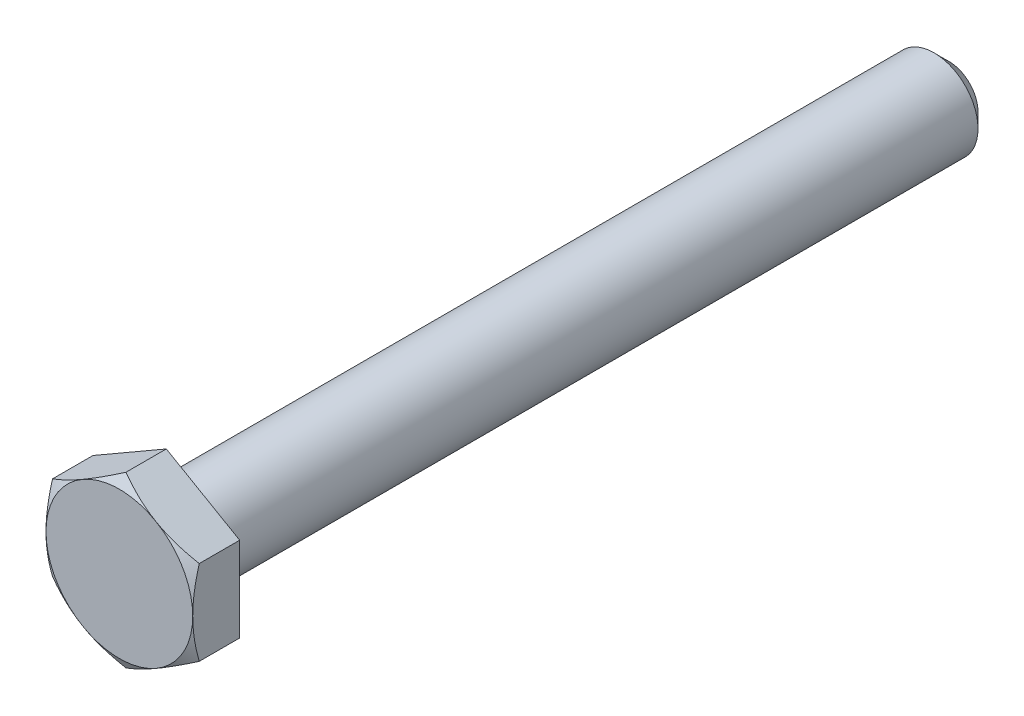
ISO-10303-21;
HEADER;
FILE_DESCRIPTION(('STEP AP214'),'2;1');
FILE_NAME('part.step','',(''),(''),'','','');
FILE_SCHEMA(('AUTOMOTIVE_DESIGN { 1 0 10303 214 1 1 1 1 }'));
ENDSEC;
DATA;
#1=APPLICATION_CONTEXT('core data for automotive mechanical design processes');
#2=APPLICATION_PROTOCOL_DEFINITION('international standard','automotive_design',2000,#1);
#3=PRODUCT_CONTEXT('',#1,'mechanical');
#4=PRODUCT('Part','Part','',(#3));
#5=PRODUCT_RELATED_PRODUCT_CATEGORY('part','',(#4));
#6=PRODUCT_DEFINITION_FORMATION('','',#4);
#7=PRODUCT_DEFINITION_CONTEXT('part definition',#1,'design');
#8=PRODUCT_DEFINITION('design','',#6,#7);
#9=PRODUCT_DEFINITION_SHAPE('','',#8);
#10=(LENGTH_UNIT() NAMED_UNIT(*) SI_UNIT(.MILLI.,.METRE.));
#11=(NAMED_UNIT(*) PLANE_ANGLE_UNIT() SI_UNIT($,.RADIAN.));
#12=(NAMED_UNIT(*) SI_UNIT($,.STERADIAN.) SOLID_ANGLE_UNIT());
#13=UNCERTAINTY_MEASURE_WITH_UNIT(LENGTH_MEASURE(1.E-05),#10,'distance_accuracy_value','');
#14=(GEOMETRIC_REPRESENTATION_CONTEXT(3) GLOBAL_UNCERTAINTY_ASSIGNED_CONTEXT((#13)) GLOBAL_UNIT_ASSIGNED_CONTEXT((#10,
#11,#12)) REPRESENTATION_CONTEXT('',''));
#15=CARTESIAN_POINT('',(0.,0.,0.));
#16=DIRECTION('',(0.,0.,1.));
#17=DIRECTION('',(1.,0.,0.));
#18=AXIS2_PLACEMENT_3D('',#15,#16,#17);
#19=CARTESIAN_POINT('',(-2.38125,1.3748153285078,1.524));
#20=DIRECTION('',(1.,0.,0.));
#21=DIRECTION('',(0.,1.,0.));
#22=AXIS2_PLACEMENT_3D('',#19,#20,#21);
#23=PLANE('',#22);
#24=CARTESIAN_POINT('',(-2.38125,-3.72295653028019,0.347295723197019));
#25=CARTESIAN_POINT('',(-2.38125,-3.61868189168975,0.39799830808582));
#26=CARTESIAN_POINT('',(-2.38125,-3.51417105650191,0.448223296245568));
#27=CARTESIAN_POINT('',(-2.38125,-3.30455147150767,0.547450011789698));
#28=CARTESIAN_POINT('',(-2.38125,-3.19944263320548,0.596451552018138));
#29=CARTESIAN_POINT('',(-2.38125,-2.98797441488905,0.693203359161538));
#30=CARTESIAN_POINT('',(-2.38125,-2.88161135972016,0.740945620586617));
#31=CARTESIAN_POINT('',(-2.38125,-2.66804955727179,0.834515667352319));
#32=CARTESIAN_POINT('',(-2.38125,-2.56085084891739,0.880343541241053));
#33=CARTESIAN_POINT('',(-2.38125,-2.34190265284614,0.971048746156232));
#34=CARTESIAN_POINT('',(-2.38125,-2.23011947827853,1.01584519844831));
#35=CARTESIAN_POINT('',(-2.38125,-2.00525654511055,1.1021198800742));
#36=CARTESIAN_POINT('',(-2.38125,-1.89217664428974,1.14359774137887));
#37=CARTESIAN_POINT('',(-2.38125,-1.66474234548094,1.22216855747077));
#38=CARTESIAN_POINT('',(-2.38125,-1.55039095344034,1.25927012747786));
#39=CARTESIAN_POINT('',(-2.38125,-1.32004815268858,1.32791783381432));
#40=CARTESIAN_POINT('',(-2.38125,-1.20405726306056,1.35946568775632));
#41=CARTESIAN_POINT('',(-2.38125,-0.971004424802135,1.41534624680367));
#42=CARTESIAN_POINT('',(-2.38125,-0.853952079694982,1.43971827503559));
#43=CARTESIAN_POINT('',(-2.38125,-0.618360932324747,1.47988575224577));
#44=CARTESIAN_POINT('',(-2.38125,-0.49982228585687,1.49568209257075));
#45=CARTESIAN_POINT('',(-2.38125,-0.263411783501214,1.51723256640088));
#46=CARTESIAN_POINT('',(-2.38125,-0.145552217253892,1.52311819825417));
#47=CARTESIAN_POINT('',(-2.38125,0.0902469882909462,1.5246964092295));
#48=CARTESIAN_POINT('',(-2.38125,0.208186629163103,1.52038878173782));
#49=CARTESIAN_POINT('',(-2.38125,0.407504133705734,1.50480280470209));
#50=CARTESIAN_POINT('',(-2.38125,0.489091811022688,1.49604313662033));
#51=CARTESIAN_POINT('',(-2.38125,0.65168776654852,1.47417502276688));
#52=CARTESIAN_POINT('',(-2.38125,0.732695968164483,1.46106601258226));
#53=CARTESIAN_POINT('',(-2.38125,0.974720383371604,1.41590017432699));
#54=CARTESIAN_POINT('',(-2.38125,1.13465239958087,1.37801199221108));
#55=CARTESIAN_POINT('',(-2.38125,1.45491499105269,1.28980234008082));
#56=CARTESIAN_POINT('',(-2.38125,1.61516887955235,1.23921303656046));
#57=CARTESIAN_POINT('',(-2.38125,1.85331898963635,1.15706065138242));
#58=CARTESIAN_POINT('',(-2.38125,1.93232383891643,1.12863451299565));
#59=CARTESIAN_POINT('',(-2.38125,2.08967618550711,1.07001988002943));
#60=CARTESIAN_POINT('',(-2.38125,2.16802369591024,1.03983142064671));
#61=CARTESIAN_POINT('',(-2.38125,2.37294280672842,0.958654138252437));
#62=CARTESIAN_POINT('',(-2.38125,2.49903666021092,0.906461988552469));
#63=CARTESIAN_POINT('',(-2.38125,2.74998136224185,0.799160341177421));
#64=CARTESIAN_POINT('',(-2.38125,2.87483209234476,0.744050568610649));
#65=CARTESIAN_POINT('',(-2.38125,3.12356108563469,0.631584800956429));
#66=CARTESIAN_POINT('',(-2.38125,3.24743903508509,0.574228114259329));
#67=CARTESIAN_POINT('',(-2.38125,3.49437791011449,0.457779044774698));
#68=CARTESIAN_POINT('',(-2.38125,3.61743881273939,0.398686613474028));
#69=CARTESIAN_POINT('',(-2.38125,3.98598417409783,0.219209412974902));
#70=CARTESIAN_POINT('',(-2.38125,4.23047577866576,0.0967882662559721));
#71=CARTESIAN_POINT('',(-2.38125,4.71762884534308,-0.151507068173107));
#72=CARTESIAN_POINT('',(-2.38125,4.96029063767842,-0.277380612845988));
#73=CARTESIAN_POINT('',(-2.38125,5.41999382326277,-0.518713110346755));
#74=CARTESIAN_POINT('',(-2.38125,5.63715482954061,-0.633944616911392));
#75=CARTESIAN_POINT('',(-2.38125,6.07073385270411,-0.865822975831002));
#76=CARTESIAN_POINT('',(-2.38125,6.28715182843929,-0.982469905002987));
#77=CARTESIAN_POINT('',(-2.38125,6.71873963784327,-1.21645326124542));
#78=CARTESIAN_POINT('',(-2.38125,6.9339112586046,-1.33378639593857));
#79=CARTESIAN_POINT('',(-2.38125,7.36378914713528,-1.56926573870378));
#80=CARTESIAN_POINT('',(-2.38125,7.57849544734519,-1.68741188752962));
#81=CARTESIAN_POINT('',(-2.38125,7.7930366029864,-1.8058550835397));
#82=B_SPLINE_CURVE_WITH_KNOTS('',3,(#24,#25,#26,#27,#28,#29,#30,#31,#32,#33,#34,#35,#36,#37,#38,
#39,#40,#41,#42,#43,#44,#45,#46,#47,#48,#49,#50,#51,#52,#53,#54,#55,#56,#57,#58,#59,#60,#61,#62,
#63,#64,#65,#66,#67,#68,#69,#70,#71,#72,#73,#74,#75,#76,#77,#78,#79,#80,#81),.UNSPECIFIED.,.F.,
.F.,(4,2,2,2,2,2,2,2,2,2,2,2,2,2,2,2,2,2,2,2,2,2,2,2,2,2,2,2,4),(0.,0.347848286322985,
0.695749462410191,1.04549398187111,1.39522230629083,1.75645680944357,2.11773131785305,
2.47828230803162,2.83872159298725,3.19714726948549,3.55553568451205,3.90913029500077,
4.26273207278691,4.50878403770547,4.75486794521598,5.24728758906121,5.75112095216684,
6.0029940882462,6.25486219568594,6.66421526437248,7.0736069702368,7.48312569426576,
7.89265587503668,8.71288987650312,9.53297212651482,10.270484381026,11.0080368420114,
11.743285197103,12.4784805286552),.UNSPECIFIED.);
#83=CARTESIAN_POINT('',(-2.38125,1.3748153285078,1.3113153285078));
#84=VERTEX_POINT('',#83);
#85=CARTESIAN_POINT('',(-2.38125,0.,1.524));
#86=VERTEX_POINT('',#85);
#87=EDGE_CURVE('E199',#84,#86,#82,.F.);
#88=ORIENTED_EDGE('',*,*,#87,.F.);
#89=DIRECTION('',(0.,0.,-1.));
#90=VECTOR('',#89,1.);
#91=CARTESIAN_POINT('',(-2.38125,1.3748153285078,1.524));
#92=LINE('',#91,#90);
#93=CARTESIAN_POINT('',(-2.38125,1.3748153285078,0.));
#94=VERTEX_POINT('',#93);
#95=EDGE_CURVE('E202',#84,#94,#92,.T.);
#96=ORIENTED_EDGE('',*,*,#95,.T.);
#97=DIRECTION('',(0.,-1.,0.));
#98=VECTOR('',#97,1.);
#99=CARTESIAN_POINT('',(-2.38125,1.3748153285078,0.));
#100=LINE('',#99,#98);
#101=CARTESIAN_POINT('',(-2.38125,-1.3748153285078,0.));
#102=VERTEX_POINT('',#101);
#103=EDGE_CURVE('E261',#94,#102,#100,.T.);
#104=ORIENTED_EDGE('',*,*,#103,.T.);
#105=DIRECTION('',(0.,0.,-1.));
#106=VECTOR('',#105,1.);
#107=CARTESIAN_POINT('',(-2.38125,-1.3748153285078,1.524));
#108=LINE('',#107,#106);
#109=CARTESIAN_POINT('',(-2.38125,-1.3748153285078,1.3113153285078));
#110=VERTEX_POINT('',#109);
#111=EDGE_CURVE('E223',#110,#102,#108,.T.);
#112=ORIENTED_EDGE('',*,*,#111,.F.);
#113=EDGE_CURVE('E171',#86,#110,#82,.F.);
#114=ORIENTED_EDGE('',*,*,#113,.F.);
#115=EDGE_LOOP('',(#88,#96,#104,#112,#114));
#116=FACE_BOUND('',#115,.T.);
#117=ADVANCED_FACE('F34',(#116),#23,.F.);
#118=CARTESIAN_POINT('',(-2.38125,-1.3748153285078,1.524));
#119=DIRECTION('',(0.5,0.866025403784439,0.));
#120=DIRECTION('',(-0.866025403784439,0.5,0.));
#121=AXIS2_PLACEMENT_3D('',#118,#119,#120);
#122=PLANE('',#121);
#123=CARTESIAN_POINT('',(-2.38145,-1.37469985845396,1.31124865764183));
#124=CARTESIAN_POINT('',(-2.27680510857802,-1.43511661468576,1.34614474988255));
#125=CARTESIAN_POINT('',(-2.1712569313955,-1.49605488319456,1.37788175573291));
#126=CARTESIAN_POINT('',(-1.95833280582789,-1.61898668440799,1.43327966568469));
#127=CARTESIAN_POINT('',(-1.85095307338658,-1.68098240183849,1.45692097092417));
#128=CARTESIAN_POINT('',(-1.63752441306379,-1.80420549632863,1.49372299311087));
#129=CARTESIAN_POINT('',(-1.53150832846243,-1.86541391131166,1.50712863194375));
#130=CARTESIAN_POINT('',(-1.31897718209788,-1.98811882587641,1.52313371400332));
#131=CARTESIAN_POINT('',(-1.21246289310218,-2.04961487930062,1.52574640919312));
#132=CARTESIAN_POINT('',(-1.01342600969028,-2.16452887751715,1.52031824805064));
#133=CARTESIAN_POINT('',(-0.920873657438137,-2.21796400300405,1.51361019155889));
#134=CARTESIAN_POINT('',(-0.736371946153155,-2.32448611568038,1.49234736779483));
#135=CARTESIAN_POINT('',(-0.644423225529255,-2.37757273428423,1.47778533338426));
#136=CARTESIAN_POINT('',(-0.459540942889938,-2.48431456993443,1.44138049969123));
#137=CARTESIAN_POINT('',(-0.366630787034623,-2.53795627342795,1.41938334353506));
#138=CARTESIAN_POINT('',(-0.182196405744564,-2.64443951311359,1.36945811380597));
#139=CARTESIAN_POINT('',(-0.0906698164537964,-2.69728241407862,1.34154177499956));
#140=CARTESIAN_POINT('',(0.000199999999998326,-2.74974612706943,1.31124865764183));
#141=B_SPLINE_CURVE_WITH_KNOTS('',3,(#123,#124,#125,#126,#127,#128,#129,#130,#131,#132,#133,
#134,#135,#136,#137,#138,#139,#140),.UNSPECIFIED.,.F.,.F.,(4,2,2,2,2,2,2,2,4),(0.,
0.377463001720441,0.755833447356088,1.12483885453941,1.49339104874267,1.81432726847354,
2.1355609551887,2.46392121913821,2.79163649648301),.UNSPECIFIED.);
#142=CARTESIAN_POINT('',(-1.190625,-2.06222299276169,1.524));
#143=VERTEX_POINT('',#142);
#144=EDGE_CURVE('E169',#110,#143,#141,.T.);
#145=ORIENTED_EDGE('',*,*,#144,.F.);
#146=ORIENTED_EDGE('',*,*,#111,.T.);
#147=DIRECTION('',(0.866025403784439,-0.5,0.));
#148=VECTOR('',#147,1.);
#149=CARTESIAN_POINT('',(-2.38125,-1.3748153285078,0.));
#150=LINE('',#149,#148);
#151=CARTESIAN_POINT('',(0.,-2.74963065701559,0.));
#152=VERTEX_POINT('',#151);
#153=EDGE_CURVE('E253',#102,#152,#150,.T.);
#154=ORIENTED_EDGE('',*,*,#153,.T.);
#155=DIRECTION('',(0.,0.,-1.));
#156=VECTOR('',#155,1.);
#157=CARTESIAN_POINT('',(0.,-2.74963065701559,1.524));
#158=LINE('',#157,#156);
#159=CARTESIAN_POINT('',(0.,-2.74963065701559,1.3113153285078));
#160=VERTEX_POINT('',#159);
#161=EDGE_CURVE('E221',#160,#152,#158,.T.);
#162=ORIENTED_EDGE('',*,*,#161,.F.);
#163=EDGE_CURVE('E165',#143,#160,#141,.T.);
#164=ORIENTED_EDGE('',*,*,#163,.F.);
#165=EDGE_LOOP('',(#145,#146,#154,#162,#164));
#166=FACE_BOUND('',#165,.T.);
#167=ADVANCED_FACE('F176',(#166),#122,.F.);
#168=CARTESIAN_POINT('',(0.,-2.74963065701559,1.524));
#169=DIRECTION('',(-0.5,0.866025403784438,0.));
#170=DIRECTION('',(-0.866025403784439,-0.5,0.));
#171=AXIS2_PLACEMENT_3D('',#168,#169,#170);
#172=PLANE('',#171);
#173=CARTESIAN_POINT('',(-0.000200000000001737,-2.74974612706943,1.31124865764183));
#174=CARTESIAN_POINT('',(0.104444891421974,-2.68932937083763,1.34614474988255));
#175=CARTESIAN_POINT('',(0.209993068604494,-2.62839110232883,1.37788175573291));
#176=CARTESIAN_POINT('',(0.422917194172109,-2.5054593011154,1.43327966568469));
#177=CARTESIAN_POINT('',(0.530296926613417,-2.4434635836849,1.45692097092417));
#178=CARTESIAN_POINT('',(0.743725586936213,-2.32024048919476,1.49372299311088));
#179=CARTESIAN_POINT('',(0.849741671537566,-2.25903207421174,1.50712863194375));
#180=CARTESIAN_POINT('',(1.06227281790212,-2.13632715964698,1.52313371400332));
#181=CARTESIAN_POINT('',(1.16878710689781,-2.07483110622277,1.52574640919312));
#182=CARTESIAN_POINT('',(1.36782399030972,-1.95991710800624,1.52031824805064));
#183=CARTESIAN_POINT('',(1.46037634256186,-1.90648198251934,1.51361019155889));
#184=CARTESIAN_POINT('',(1.64487805384684,-1.79995986984301,1.49234736779484));
#185=CARTESIAN_POINT('',(1.73682677447075,-1.74687325123916,1.47778533338426));
#186=CARTESIAN_POINT('',(1.92170905711006,-1.64013141558895,1.44138049969123));
#187=CARTESIAN_POINT('',(2.01461921296538,-1.58648971209544,1.41938334353506));
#188=CARTESIAN_POINT('',(2.19905359425544,-1.4800064724098,1.36945811380597));
#189=CARTESIAN_POINT('',(2.29058018354621,-1.42716357144477,1.34154177499956));
#190=CARTESIAN_POINT('',(2.38145,-1.37469985845396,1.31124865764183));
#191=B_SPLINE_CURVE_WITH_KNOTS('',3,(#173,#174,#175,#176,#177,#178,#179,#180,#181,#182,#183,
#184,#185,#186,#187,#188,#189,#190),.UNSPECIFIED.,.F.,.F.,(4,2,2,2,2,2,2,2,4),(0.,
0.377463001720441,0.755833447356088,1.12483885453941,1.49339104874267,1.81432726847354,
2.1355609551887,2.46392121913821,2.79163649648301),.UNSPECIFIED.);
#192=CARTESIAN_POINT('',(1.190625,-2.06222299276169,1.524));
#193=VERTEX_POINT('',#192);
#194=EDGE_CURVE('E170',#160,#193,#191,.T.);
#195=ORIENTED_EDGE('',*,*,#194,.F.);
#196=ORIENTED_EDGE('',*,*,#161,.T.);
#197=DIRECTION('',(0.866025403784438,0.5,0.));
#198=VECTOR('',#197,1.);
#199=CARTESIAN_POINT('',(0.,-2.74963065701559,0.));
#200=LINE('',#199,#198);
#201=CARTESIAN_POINT('',(2.38125,-1.37481532850779,0.));
#202=VERTEX_POINT('',#201);
#203=EDGE_CURVE('E248',#152,#202,#200,.T.);
#204=ORIENTED_EDGE('',*,*,#203,.T.);
#205=DIRECTION('',(0.,0.,-1.));
#206=VECTOR('',#205,1.);
#207=CARTESIAN_POINT('',(2.38125,-1.37481532850779,1.524));
#208=LINE('',#207,#206);
#209=CARTESIAN_POINT('',(2.38125,-1.374815328508,1.31131532850793));
#210=VERTEX_POINT('',#209);
#211=EDGE_CURVE('E219',#210,#202,#208,.T.);
#212=ORIENTED_EDGE('',*,*,#211,.F.);
#213=EDGE_CURVE('E159',#193,#210,#191,.T.);
#214=ORIENTED_EDGE('',*,*,#213,.F.);
#215=EDGE_LOOP('',(#195,#196,#204,#212,#214));
#216=FACE_BOUND('',#215,.T.);
#217=ADVANCED_FACE('F179',(#216),#172,.F.);
#218=CARTESIAN_POINT('',(2.38125,-1.37481532850779,1.524));
#219=DIRECTION('',(-1.,0.,0.));
#220=DIRECTION('',(0.,0.,1.));
#221=AXIS2_PLACEMENT_3D('',#218,#219,#220);
#222=PLANE('',#221);
#223=CARTESIAN_POINT('',(2.38125,-3.72295652963773,0.347295723509494));
#224=CARTESIAN_POINT('',(2.38125,-3.6186818910689,0.397998308385245));
#225=CARTESIAN_POINT('',(2.38125,-3.5141710559027,0.448223296531951));
#226=CARTESIAN_POINT('',(2.38125,-3.30455147095179,0.547450012050059));
#227=CARTESIAN_POINT('',(2.38125,-3.19944263267129,0.59645155226552));
#228=CARTESIAN_POINT('',(2.38125,-2.98797441439859,0.693203359382952));
#229=CARTESIAN_POINT('',(2.38125,-2.88161135925173,0.740945620795045));
#230=CARTESIAN_POINT('',(2.38125,-2.66804955684758,0.834515667534991));
#231=CARTESIAN_POINT('',(2.38125,-2.56085084851536,0.880343541410955));
#232=CARTESIAN_POINT('',(2.38125,-2.34190265249017,0.971048746300243));
#233=CARTESIAN_POINT('',(2.38125,-2.23011947794644,1.01584519857922));
#234=CARTESIAN_POINT('',(2.38125,-2.00525654482662,1.10211988017963));
#235=CARTESIAN_POINT('',(2.38125,-1.89217664403008,1.14359774147191));
#236=CARTESIAN_POINT('',(2.38125,-1.66474234527027,1.22216855754021));
#237=CARTESIAN_POINT('',(2.38125,-1.55039095325439,1.2592701275361));
#238=CARTESIAN_POINT('',(2.38125,-1.32004815255276,1.32791783385198));
#239=CARTESIAN_POINT('',(2.38125,-1.20405726295013,1.3594656877846));
#240=CARTESIAN_POINT('',(2.38125,-0.971004424755568,1.41534624681304));
#241=CARTESIAN_POINT('',(2.38125,-0.853952079687063,1.43971827503616));
#242=CARTESIAN_POINT('',(2.38125,-0.618360932395054,1.47988575223456));
#243=CARTESIAN_POINT('',(2.38125,-0.499822285966753,1.49568209255657));
#244=CARTESIAN_POINT('',(2.38125,-0.263411783689592,1.51723256638781));
#245=CARTESIAN_POINT('',(2.38125,-0.145552217481182,1.52311819824505));
#246=CARTESIAN_POINT('',(2.38125,0.0902469879864318,1.52469640923506));
#247=CARTESIAN_POINT('',(2.38125,0.208186628820277,1.52038878175411));
#248=CARTESIAN_POINT('',(2.38125,0.407504133314729,1.50480280474002));
#249=CARTESIAN_POINT('',(2.38125,0.489091810621384,1.49604313666685));
#250=CARTESIAN_POINT('',(2.38125,0.651687766127075,1.47417502283102));
#251=CARTESIAN_POINT('',(2.38125,0.732695967733197,1.46106601265545));
#252=CARTESIAN_POINT('',(2.38125,0.974720382911327,1.4159001744275));
#253=CARTESIAN_POINT('',(2.38125,1.13465239910202,1.37801199233005));
#254=CARTESIAN_POINT('',(2.38125,1.45491499053651,1.28980234023628));
#255=CARTESIAN_POINT('',(2.38125,1.61516887901744,1.23921303673396));
#256=CARTESIAN_POINT('',(2.38125,1.85331898907346,1.15706065158206));
#257=CARTESIAN_POINT('',(2.38125,1.93232383834426,1.12863451320384));
#258=CARTESIAN_POINT('',(2.38125,2.08967618491637,1.07001988025444));
#259=CARTESIAN_POINT('',(2.38125,2.16802369531021,1.03983142087997));
#260=CARTESIAN_POINT('',(2.38125,2.37294280612284,0.958654138499555));
#261=CARTESIAN_POINT('',(2.38125,2.49903665960882,0.906461988804388));
#262=CARTESIAN_POINT('',(2.38125,2.74998136164628,0.799160341437603));
#263=CARTESIAN_POINT('',(2.38125,2.87483209175223,0.744050568874293));
#264=CARTESIAN_POINT('',(2.38125,3.12356108504793,0.631584801226017));
#265=CARTESIAN_POINT('',(2.38125,3.24743903450104,0.574228114531399));
#266=CARTESIAN_POINT('',(2.38125,3.4943779095356,0.457779045051025));
#267=CARTESIAN_POINT('',(2.38125,3.61743881216293,0.39868661375213));
#268=CARTESIAN_POINT('',(2.38125,3.9859841735286,0.21920941325743));
#269=CARTESIAN_POINT('',(2.38125,4.23047577810101,0.0967882665403723));
#270=CARTESIAN_POINT('',(2.38125,4.71762884478668,-0.151507067886102));
#271=CARTESIAN_POINT('',(2.38125,4.96029063712589,-0.27738061255825));
#272=CARTESIAN_POINT('',(2.38125,5.41999382271414,-0.518713110056654));
#273=CARTESIAN_POINT('',(2.38125,5.63715482899205,-0.633944616619566));
#274=CARTESIAN_POINT('',(2.38125,6.07073385215553,-0.865822975536079));
#275=CARTESIAN_POINT('',(2.38125,6.28715182789062,-0.982469904706691));
#276=CARTESIAN_POINT('',(2.38125,6.71873963729376,-1.21645326094634));
#277=CARTESIAN_POINT('',(2.38125,6.93391125805436,-1.33378639563807));
#278=CARTESIAN_POINT('',(2.38125,7.36378914658346,-1.56926573840061));
#279=CARTESIAN_POINT('',(2.38125,7.57849544679253,-1.68741188722519));
#280=CARTESIAN_POINT('',(2.38125,7.79303660243287,-1.80585508323407));
#281=B_SPLINE_CURVE_WITH_KNOTS('',3,(#223,#224,#225,#226,#227,#228,#229,#230,#231,#232,#233,
#234,#235,#236,#237,#238,#239,#240,#241,#242,#243,#244,#245,#246,#247,#248,#249,#250,#251,#252,
#253,#254,#255,#256,#257,#258,#259,#260,#261,#262,#263,#264,#265,#266,#267,#268,#269,#270,#271,
#272,#273,#274,#275,#276,#277,#278,#279,#280),.UNSPECIFIED.,.F.,.F.,(4,2,2,2,2,2,2,2,2,2,2,2,2,
2,2,2,2,2,2,2,2,2,2,2,2,2,2,2,4),(0.,0.347848286247547,0.695749462259305,1.04549398164397,
1.39522230598744,1.75645680905906,2.11773131738739,2.47828230748509,2.8387215923599,
3.1971472687395,3.55553568364759,3.90913029402076,4.26273207169129,4.50878403657638,
4.75486794405342,5.24728758783158,5.7511209508672,6.00299408691165,6.25486219431648,
6.66421526300712,7.07360696887559,7.4831256929088,7.89265587368399,8.71288987515987,
9.53297212518087,10.2704843796898,11.008036840673,11.7432851957606,12.4784805273088),.UNSPECIFIED.);
#282=CARTESIAN_POINT('',(2.38125,0.,1.524));
#283=VERTEX_POINT('',#282);
#284=EDGE_CURVE('E243',#210,#283,#281,.T.);
#285=ORIENTED_EDGE('',*,*,#284,.F.);
#286=ORIENTED_EDGE('',*,*,#211,.T.);
#287=DIRECTION('',(0.,1.,0.));
#288=VECTOR('',#287,1.);
#289=CARTESIAN_POINT('',(2.38125,-1.37481532850779,0.));
#290=LINE('',#289,#288);
#291=CARTESIAN_POINT('',(2.38125,1.3748153285078,0.));
#292=VERTEX_POINT('',#291);
#293=EDGE_CURVE('E252',#202,#292,#290,.T.);
#294=ORIENTED_EDGE('',*,*,#293,.T.);
#295=DIRECTION('',(0.,0.,-1.));
#296=VECTOR('',#295,1.);
#297=CARTESIAN_POINT('',(2.38125,1.3748153285078,1.524));
#298=LINE('',#297,#296);
#299=CARTESIAN_POINT('',(2.38125,1.3748153285078,1.3113153285078));
#300=VERTEX_POINT('',#299);
#301=EDGE_CURVE('E212',#300,#292,#298,.T.);
#302=ORIENTED_EDGE('',*,*,#301,.F.);
#303=EDGE_CURVE('E106',#283,#300,#281,.T.);
#304=ORIENTED_EDGE('',*,*,#303,.F.);
#305=EDGE_LOOP('',(#285,#286,#294,#302,#304));
#306=FACE_BOUND('',#305,.T.);
#307=ADVANCED_FACE('F183',(#306),#222,.F.);
#308=CARTESIAN_POINT('',(2.38125,1.3748153285078,1.524));
#309=DIRECTION('',(-0.5,-0.866025403784439,0.));
#310=DIRECTION('',(0.866025403784439,-0.5,0.));
#311=AXIS2_PLACEMENT_3D('',#308,#309,#310);
#312=PLANE('',#311);
#313=CARTESIAN_POINT('',(2.38145,1.37469985845396,1.31124865764183));
#314=CARTESIAN_POINT('',(2.27680510857802,1.43511661468576,1.34614474988255));
#315=CARTESIAN_POINT('',(2.1712569313955,1.49605488319456,1.37788175573291));
#316=CARTESIAN_POINT('',(1.95833280582789,1.61898668440799,1.43327966568469));
#317=CARTESIAN_POINT('',(1.85095307338658,1.68098240183849,1.45692097092417));
#318=CARTESIAN_POINT('',(1.63752441306379,1.80420549632863,1.49372299311087));
#319=CARTESIAN_POINT('',(1.53150832846243,1.86541391131166,1.50712863194375));
#320=CARTESIAN_POINT('',(1.31897718209788,1.98811882587641,1.52313371400332));
#321=CARTESIAN_POINT('',(1.21246289310218,2.04961487930062,1.52574640919312));
#322=CARTESIAN_POINT('',(1.01342600969028,2.16452887751715,1.52031824805064));
#323=CARTESIAN_POINT('',(0.920873657438137,2.21796400300405,1.51361019155889));
#324=CARTESIAN_POINT('',(0.736371946153155,2.32448611568038,1.49234736779483));
#325=CARTESIAN_POINT('',(0.644423225529254,2.37757273428423,1.47778533338426));
#326=CARTESIAN_POINT('',(0.459540942889937,2.48431456993444,1.44138049969123));
#327=CARTESIAN_POINT('',(0.366630787034622,2.53795627342795,1.41938334353506));
#328=CARTESIAN_POINT('',(0.182196405744563,2.64443951311359,1.36945811380597));
#329=CARTESIAN_POINT('',(0.0906698164537958,2.69728241407862,1.34154177499956));
#330=CARTESIAN_POINT('',(-0.000199999999999503,2.74974612706943,1.31124865764183));
#331=B_SPLINE_CURVE_WITH_KNOTS('',3,(#313,#314,#315,#316,#317,#318,#319,#320,#321,#322,#323,
#324,#325,#326,#327,#328,#329,#330),.UNSPECIFIED.,.F.,.F.,(4,2,2,2,2,2,2,2,4),(0.,
0.377463001720441,0.755833447356088,1.12483885453941,1.49339104874267,1.81432726847354,
2.1355609551887,2.46392121913821,2.79163649648301),.UNSPECIFIED.);
#332=CARTESIAN_POINT('',(1.190625,2.06222299276169,1.524));
#333=VERTEX_POINT('',#332);
#334=EDGE_CURVE('E103',#300,#333,#331,.T.);
#335=ORIENTED_EDGE('',*,*,#334,.F.);
#336=ORIENTED_EDGE('',*,*,#301,.T.);
#337=DIRECTION('',(-0.866025403784439,0.5,0.));
#338=VECTOR('',#337,1.);
#339=CARTESIAN_POINT('',(2.38125,1.3748153285078,0.));
#340=LINE('',#339,#338);
#341=CARTESIAN_POINT('',(0.,2.7496306570156,0.));
#342=VERTEX_POINT('',#341);
#343=EDGE_CURVE('E214',#292,#342,#340,.T.);
#344=ORIENTED_EDGE('',*,*,#343,.T.);
#345=DIRECTION('',(0.,0.,-1.));
#346=VECTOR('',#345,1.);
#347=CARTESIAN_POINT('',(0.,2.7496306570156,1.524));
#348=LINE('',#347,#346);
#349=CARTESIAN_POINT('',(0.,2.7496306570156,1.3113153285078));
#350=VERTEX_POINT('',#349);
#351=EDGE_CURVE('E127',#350,#342,#348,.T.);
#352=ORIENTED_EDGE('',*,*,#351,.F.);
#353=EDGE_CURVE('E110',#333,#350,#331,.T.);
#354=ORIENTED_EDGE('',*,*,#353,.F.);
#355=EDGE_LOOP('',(#335,#336,#344,#352,#354));
#356=FACE_BOUND('',#355,.T.);
#357=ADVANCED_FACE('F125',(#356),#312,.F.);
#358=CARTESIAN_POINT('',(0.,2.7496306570156,1.524));
#359=DIRECTION('',(0.5,-0.866025403784438,0.));
#360=DIRECTION('',(0.866025403784438,0.5,0.));
#361=AXIS2_PLACEMENT_3D('',#358,#359,#360);
#362=PLANE('',#361);
#363=CARTESIAN_POINT('',(0.000200000000000133,2.74974612706943,1.31124865764183));
#364=CARTESIAN_POINT('',(-0.104444891421976,2.68932937083764,1.34614474988255));
#365=CARTESIAN_POINT('',(-0.209993068604496,2.62839110232883,1.37788175573291));
#366=CARTESIAN_POINT('',(-0.422917194172111,2.50545930111541,1.43327966568469));
#367=CARTESIAN_POINT('',(-0.530296926613419,2.44346358368491,1.45692097092417));
#368=CARTESIAN_POINT('',(-0.743725586936215,2.32024048919476,1.49372299311087));
#369=CARTESIAN_POINT('',(-0.849741671537568,2.25903207421174,1.50712863194375));
#370=CARTESIAN_POINT('',(-1.06227281790212,2.13632715964698,1.52313371400332));
#371=CARTESIAN_POINT('',(-1.16878710689782,2.07483110622278,1.52574640919312));
#372=CARTESIAN_POINT('',(-1.36782399030973,1.95991710800625,1.52031824805064));
#373=CARTESIAN_POINT('',(-1.46037634256186,1.90648198251934,1.51361019155889));
#374=CARTESIAN_POINT('',(-1.64487805384685,1.79995986984301,1.49234736779484));
#375=CARTESIAN_POINT('',(-1.73682677447075,1.74687325123916,1.47778533338426));
#376=CARTESIAN_POINT('',(-1.92170905711006,1.64013141558896,1.44138049969123));
#377=CARTESIAN_POINT('',(-2.01461921296538,1.58648971209544,1.41938334353506));
#378=CARTESIAN_POINT('',(-2.19905359425544,1.4800064724098,1.36945811380597));
#379=CARTESIAN_POINT('',(-2.29058018354621,1.42716357144477,1.34154177499956));
#380=CARTESIAN_POINT('',(-2.38145,1.37469985845396,1.31124865764183));
#381=B_SPLINE_CURVE_WITH_KNOTS('',3,(#363,#364,#365,#366,#367,#368,#369,#370,#371,#372,#373,
#374,#375,#376,#377,#378,#379,#380),.UNSPECIFIED.,.F.,.F.,(4,2,2,2,2,2,2,2,4),(0.,
0.377463001720442,0.755833447356089,1.12483885453941,1.49339104874267,1.81432726847354,
2.1355609551887,2.46392121913821,2.79163649648301),.UNSPECIFIED.);
#382=CARTESIAN_POINT('',(-1.190625,2.0622229927617,1.524));
#383=VERTEX_POINT('',#382);
#384=EDGE_CURVE('E116',#350,#383,#381,.T.);
#385=ORIENTED_EDGE('',*,*,#384,.F.);
#386=ORIENTED_EDGE('',*,*,#351,.T.);
#387=DIRECTION('',(-0.866025403784438,-0.5,0.));
#388=VECTOR('',#387,1.);
#389=CARTESIAN_POINT('',(0.,2.7496306570156,0.));
#390=LINE('',#389,#388);
#391=EDGE_CURVE('E209',#342,#94,#390,.T.);
#392=ORIENTED_EDGE('',*,*,#391,.T.);
#393=ORIENTED_EDGE('',*,*,#95,.F.);
#394=EDGE_CURVE('E122',#383,#84,#381,.T.);
#395=ORIENTED_EDGE('',*,*,#394,.F.);
#396=EDGE_LOOP('',(#385,#386,#392,#393,#395));
#397=FACE_BOUND('',#396,.T.);
#398=ADVANCED_FACE('F191',(#397),#362,.F.);
#399=CARTESIAN_POINT('',(-2.38125,-1.3748153285078,0.));
#400=DIRECTION('',(0.,0.,1.));
#401=DIRECTION('',(1.,0.,0.));
#402=AXIS2_PLACEMENT_3D('',#399,#400,#401);
#403=PLANE('',#402);
#404=ORIENTED_EDGE('',*,*,#103,.F.);
#405=ORIENTED_EDGE('',*,*,#391,.F.);
#406=ORIENTED_EDGE('',*,*,#343,.F.);
#407=ORIENTED_EDGE('',*,*,#293,.F.);
#408=ORIENTED_EDGE('',*,*,#203,.F.);
#409=ORIENTED_EDGE('',*,*,#153,.F.);
#410=EDGE_LOOP('',(#404,#405,#406,#407,#408,#409));
#411=FACE_BOUND('',#410,.T.);
#412=CARTESIAN_POINT('',(0.,0.,0.));
#413=DIRECTION('',(0.,0.,1.));
#414=DIRECTION('',(1.,0.,0.));
#415=AXIS2_PLACEMENT_3D('',#412,#413,#414);
#416=CIRCLE('',#415,1.4224);
#417=CARTESIAN_POINT('',(1.4224,0.,0.));
#418=VERTEX_POINT('',#417);
#419=EDGE_CURVE('E224',#418,#418,#416,.F.);
#420=ORIENTED_EDGE('',*,*,#419,.F.);
#421=EDGE_LOOP('',(#420));
#422=FACE_BOUND('',#421,.T.);
#423=ADVANCED_FACE('F256',(#411,#422),#403,.F.);
#424=CARTESIAN_POINT('',(0.,0.,-25.4));
#425=DIRECTION('',(0.,0.,1.));
#426=DIRECTION('',(1.,0.,0.));
#427=AXIS2_PLACEMENT_3D('',#424,#425,#426);
#428=PLANE('',#427);
#429=CARTESIAN_POINT('',(0.,0.,-25.4));
#430=DIRECTION('',(0.,0.,1.));
#431=DIRECTION('',(1.,0.,0.));
#432=AXIS2_PLACEMENT_3D('',#429,#430,#431);
#433=CIRCLE('',#432,0.946150000000007);
#434=CARTESIAN_POINT('',(0.946150000000007,0.,-25.4));
#435=VERTEX_POINT('',#434);
#436=EDGE_CURVE('E263',#435,#435,#433,.F.);
#437=ORIENTED_EDGE('',*,*,#436,.T.);
#438=EDGE_LOOP('',(#437));
#439=FACE_BOUND('',#438,.T.);
#440=ADVANCED_FACE('F277',(#439),#428,.F.);
#441=CARTESIAN_POINT('',(0.,0.,0.));
#442=DIRECTION('',(0.,0.,1.));
#443=DIRECTION('',(1.,0.,0.));
#444=AXIS2_PLACEMENT_3D('',#441,#442,#443);
#445=CYLINDRICAL_SURFACE('',#444,1.4224);
#446=CARTESIAN_POINT('',(0.,0.,-24.92375));
#447=DIRECTION('',(0.,0.,1.));
#448=DIRECTION('',(1.,0.,0.));
#449=AXIS2_PLACEMENT_3D('',#446,#447,#448);
#450=CIRCLE('',#449,1.4224);
#451=CARTESIAN_POINT('',(1.4224,0.,-24.92375));
#452=VERTEX_POINT('',#451);
#453=EDGE_CURVE('E206',#452,#452,#450,.T.);
#454=ORIENTED_EDGE('',*,*,#453,.T.);
#455=EDGE_LOOP('',(#454));
#456=FACE_BOUND('',#455,.T.);
#457=ORIENTED_EDGE('',*,*,#419,.T.);
#458=EDGE_LOOP('',(#457));
#459=FACE_BOUND('',#458,.T.);
#460=ADVANCED_FACE('F151',(#456,#459),#445,.T.);
#461=CARTESIAN_POINT('',(0.,0.,-24.92375));
#462=DIRECTION('',(0.,0.,1.));
#463=DIRECTION('',(1.,0.,0.));
#464=AXIS2_PLACEMENT_3D('',#461,#462,#463);
#465=CONICAL_SURFACE('',#464,1.4224,0.785398163397446);
#466=ORIENTED_EDGE('',*,*,#436,.F.);
#467=EDGE_LOOP('',(#466));
#468=FACE_BOUND('',#467,.T.);
#469=ORIENTED_EDGE('',*,*,#453,.F.);
#470=EDGE_LOOP('',(#469));
#471=FACE_BOUND('',#470,.T.);
#472=ADVANCED_FACE('F269',(#468,#471),#465,.T.);
#473=CARTESIAN_POINT('',(0.,0.,1.524));
#474=DIRECTION('',(0.,0.,-1.));
#475=DIRECTION('',(1.,0.,0.));
#476=AXIS2_PLACEMENT_3D('',#473,#474,#475);
#477=CONICAL_SURFACE('',#476,2.38125,1.0471975511966);
#478=ORIENTED_EDGE('',*,*,#213,.T.);
#479=ORIENTED_EDGE('',*,*,#284,.T.);
#480=CARTESIAN_POINT('',(0.,0.,1.524));
#481=DIRECTION('',(0.,0.,1.));
#482=DIRECTION('',(1.,0.,0.));
#483=AXIS2_PLACEMENT_3D('',#480,#481,#482);
#484=CIRCLE('',#483,2.38125);
#485=EDGE_CURVE('E38',#193,#283,#484,.T.);
#486=ORIENTED_EDGE('',*,*,#485,.F.);
#487=EDGE_LOOP('',(#478,#479,#486));
#488=FACE_BOUND('',#487,.T.);
#489=ADVANCED_FACE('F245',(#488),#477,.T.);
#490=ORIENTED_EDGE('',*,*,#163,.T.);
#491=ORIENTED_EDGE('',*,*,#194,.T.);
#492=EDGE_CURVE('E228',#143,#193,#484,.T.);
#493=ORIENTED_EDGE('',*,*,#492,.F.);
#494=EDGE_LOOP('',(#490,#491,#493));
#495=FACE_BOUND('',#494,.T.);
#496=ADVANCED_FACE('F240',(#495),#477,.T.);
#497=ORIENTED_EDGE('',*,*,#113,.T.);
#498=ORIENTED_EDGE('',*,*,#144,.T.);
#499=EDGE_CURVE('E229',#86,#143,#484,.T.);
#500=ORIENTED_EDGE('',*,*,#499,.F.);
#501=EDGE_LOOP('',(#497,#498,#500));
#502=FACE_BOUND('',#501,.T.);
#503=ADVANCED_FACE('F149',(#502),#477,.T.);
#504=ORIENTED_EDGE('',*,*,#87,.T.);
#505=EDGE_CURVE('E43',#383,#86,#484,.T.);
#506=ORIENTED_EDGE('',*,*,#505,.F.);
#507=ORIENTED_EDGE('',*,*,#394,.T.);
#508=EDGE_LOOP('',(#504,#506,#507));
#509=FACE_BOUND('',#508,.T.);
#510=ADVANCED_FACE('F145',(#509),#477,.T.);
#511=ORIENTED_EDGE('',*,*,#353,.T.);
#512=ORIENTED_EDGE('',*,*,#384,.T.);
#513=EDGE_CURVE('E12',#333,#383,#484,.T.);
#514=ORIENTED_EDGE('',*,*,#513,.F.);
#515=EDGE_LOOP('',(#511,#512,#514));
#516=FACE_BOUND('',#515,.T.);
#517=ADVANCED_FACE('F114',(#516),#477,.T.);
#518=ORIENTED_EDGE('',*,*,#303,.T.);
#519=ORIENTED_EDGE('',*,*,#334,.T.);
#520=CARTESIAN_POINT('',(0.,0.,1.524));
#521=DIRECTION('',(0.,0.,1.));
#522=DIRECTION('',(1.,0.,0.));
#523=AXIS2_PLACEMENT_3D('',#520,#521,#522);
#524=CIRCLE('',#523,2.38125);
#525=EDGE_CURVE('E50',#283,#333,#524,.T.);
#526=ORIENTED_EDGE('',*,*,#525,.F.);
#527=EDGE_LOOP('',(#518,#519,#526));
#528=FACE_BOUND('',#527,.T.);
#529=ADVANCED_FACE('F104',(#528),#477,.T.);
#530=CARTESIAN_POINT('',(-2.38125,-1.3748153285078,1.524));
#531=DIRECTION('',(0.,0.,1.));
#532=DIRECTION('',(1.,0.,0.));
#533=AXIS2_PLACEMENT_3D('',#530,#531,#532);
#534=PLANE('',#533);
#535=ORIENTED_EDGE('',*,*,#485,.T.);
#536=ORIENTED_EDGE('',*,*,#525,.T.);
#537=ORIENTED_EDGE('',*,*,#513,.T.);
#538=ORIENTED_EDGE('',*,*,#505,.T.);
#539=ORIENTED_EDGE('',*,*,#499,.T.);
#540=ORIENTED_EDGE('',*,*,#492,.T.);
#541=EDGE_LOOP('',(#535,#536,#537,#538,#539,#540));
#542=FACE_BOUND('',#541,.T.);
#543=ADVANCED_FACE('F119',(#542),#534,.T.);
#544=CLOSED_SHELL('',(#117,#167,#217,#307,#357,#398,#423,#440,#460,#472,#489,#496,#503,#510,
#517,#529,#543));
#545=MANIFOLD_SOLID_BREP('B2',#544);
#546=ADVANCED_BREP_SHAPE_REPRESENTATION('',(#18,#545),#14);
#547=SHAPE_DEFINITION_REPRESENTATION(#9,#546);
ENDSEC;
END-ISO-10303-21;
